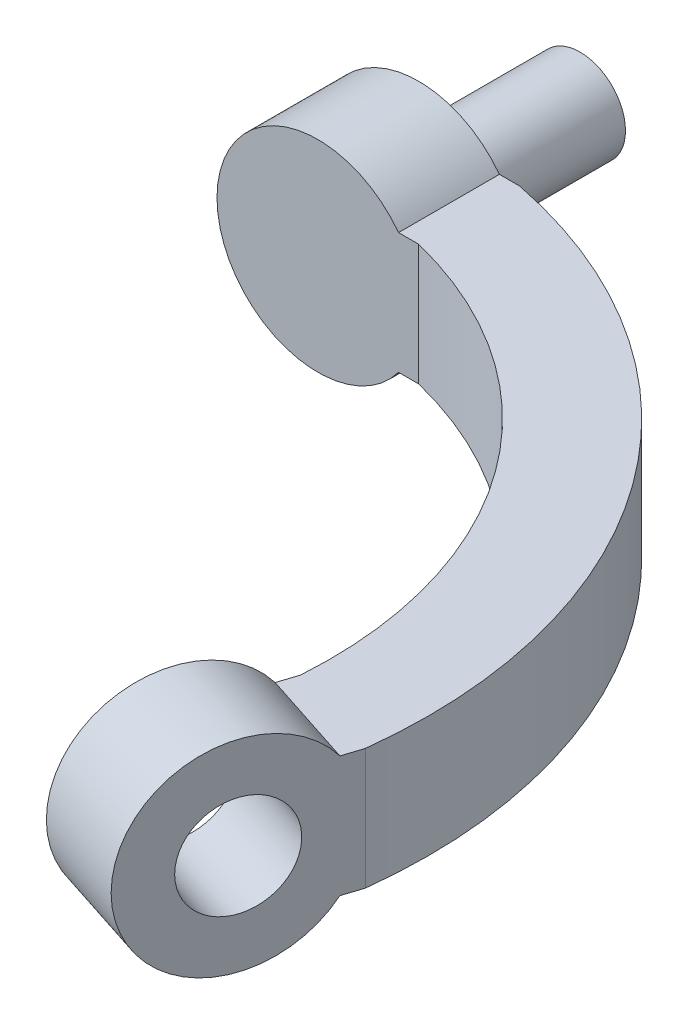
ISO-10303-21;
HEADER;
FILE_DESCRIPTION(('STEP AP214'),'2;1');
FILE_NAME('part.step','',(''),(''),'','','');
FILE_SCHEMA(('AUTOMOTIVE_DESIGN { 1 0 10303 214 1 1 1 1 }'));
ENDSEC;
DATA;
#1=APPLICATION_CONTEXT('core data for automotive mechanical design processes');
#2=APPLICATION_PROTOCOL_DEFINITION('international standard','automotive_design',2000,#1);
#3=PRODUCT_CONTEXT('',#1,'mechanical');
#4=PRODUCT('Part','Part','',(#3));
#5=PRODUCT_RELATED_PRODUCT_CATEGORY('part','',(#4));
#6=PRODUCT_DEFINITION_FORMATION('','',#4);
#7=PRODUCT_DEFINITION_CONTEXT('part definition',#1,'design');
#8=PRODUCT_DEFINITION('design','',#6,#7);
#9=PRODUCT_DEFINITION_SHAPE('','',#8);
#10=(LENGTH_UNIT() NAMED_UNIT(*) SI_UNIT(.MILLI.,.METRE.));
#11=(NAMED_UNIT(*) PLANE_ANGLE_UNIT() SI_UNIT($,.RADIAN.));
#12=(NAMED_UNIT(*) SI_UNIT($,.STERADIAN.) SOLID_ANGLE_UNIT());
#13=UNCERTAINTY_MEASURE_WITH_UNIT(LENGTH_MEASURE(1.E-05),#10,'distance_accuracy_value','');
#14=(GEOMETRIC_REPRESENTATION_CONTEXT(3) GLOBAL_UNCERTAINTY_ASSIGNED_CONTEXT((#13)) GLOBAL_UNIT_ASSIGNED_CONTEXT((#10,
#11,#12)) REPRESENTATION_CONTEXT('',''));
#15=CARTESIAN_POINT('',(0.,0.,0.));
#16=DIRECTION('',(0.,0.,1.));
#17=DIRECTION('',(1.,0.,0.));
#18=AXIS2_PLACEMENT_3D('',#15,#16,#17);
#19=CARTESIAN_POINT('',(0.,0.,5.));
#20=DIRECTION('',(0.,0.,-1.));
#21=DIRECTION('',(-1.,0.,0.));
#22=AXIS2_PLACEMENT_3D('',#19,#20,#21);
#23=CYLINDRICAL_SURFACE('',#22,5.);
#24=DIRECTION('',(0.,0.,-1.));
#25=VECTOR('',#24,1.);
#26=CARTESIAN_POINT('',(4.,-3.,5.));
#27=LINE('',#26,#25);
#28=CARTESIAN_POINT('',(4.,-3.,5.));
#29=VERTEX_POINT('',#28);
#30=CARTESIAN_POINT('',(4.,-3.,0.));
#31=VERTEX_POINT('',#30);
#32=EDGE_CURVE('E51',#29,#31,#27,.T.);
#33=ORIENTED_EDGE('',*,*,#32,.F.);
#34=CARTESIAN_POINT('',(0.,0.,5.));
#35=DIRECTION('',(0.,0.,1.));
#36=DIRECTION('',(1.,0.,0.));
#37=AXIS2_PLACEMENT_3D('',#34,#35,#36);
#38=CIRCLE('',#37,5.);
#39=CARTESIAN_POINT('',(4.,3.,5.));
#40=VERTEX_POINT('',#39);
#41=EDGE_CURVE('E11',#40,#29,#38,.T.);
#42=ORIENTED_EDGE('',*,*,#41,.F.);
#43=DIRECTION('',(0.,0.,-1.));
#44=VECTOR('',#43,1.);
#45=CARTESIAN_POINT('',(4.,3.,5.));
#46=LINE('',#45,#44);
#47=CARTESIAN_POINT('',(4.,3.,0.));
#48=VERTEX_POINT('',#47);
#49=EDGE_CURVE('E150',#48,#40,#46,.F.);
#50=ORIENTED_EDGE('',*,*,#49,.F.);
#51=CARTESIAN_POINT('',(0.,0.,0.));
#52=DIRECTION('',(0.,0.,1.));
#53=DIRECTION('',(1.,0.,0.));
#54=AXIS2_PLACEMENT_3D('',#51,#52,#53);
#55=CIRCLE('',#54,5.);
#56=EDGE_CURVE('E40',#48,#31,#55,.T.);
#57=ORIENTED_EDGE('',*,*,#56,.T.);
#58=EDGE_LOOP('',(#33,#42,#50,#57));
#59=FACE_BOUND('',#58,.T.);
#60=ADVANCED_FACE('F37',(#59),#23,.T.);
#61=CARTESIAN_POINT('',(0.,0.,5.));
#62=DIRECTION('',(0.,0.,1.));
#63=DIRECTION('',(1.,0.,0.));
#64=AXIS2_PLACEMENT_3D('',#61,#62,#63);
#65=PLANE('',#64);
#66=DIRECTION('',(1.,0.,0.));
#67=VECTOR('',#66,1.);
#68=CARTESIAN_POINT('',(2.,-3.,4.99999999999998));
#69=LINE('',#68,#67);
#70=CARTESIAN_POINT('',(4.9999999999999,-3.,4.99999999999998));
#71=VERTEX_POINT('',#70);
#72=EDGE_CURVE('E147',#29,#71,#69,.T.);
#73=ORIENTED_EDGE('',*,*,#72,.T.);
#74=DIRECTION('',(0.,1.,0.));
#75=VECTOR('',#74,1.);
#76=CARTESIAN_POINT('',(5.,-3.,4.99999999999998));
#77=LINE('',#76,#75);
#78=CARTESIAN_POINT('',(4.9999999999999,3.,4.99999999999998));
#79=VERTEX_POINT('',#78);
#80=EDGE_CURVE('E134',#71,#79,#77,.T.);
#81=ORIENTED_EDGE('',*,*,#80,.T.);
#82=DIRECTION('',(1.,0.,0.));
#83=VECTOR('',#82,1.);
#84=CARTESIAN_POINT('',(2.,3.,4.99999999999998));
#85=LINE('',#84,#83);
#86=EDGE_CURVE('E122',#40,#79,#85,.T.);
#87=ORIENTED_EDGE('',*,*,#86,.F.);
#88=ORIENTED_EDGE('',*,*,#41,.T.);
#89=EDGE_LOOP('',(#73,#81,#87,#88));
#90=FACE_BOUND('',#89,.T.);
#91=ADVANCED_FACE('F206',(#90),#65,.T.);
#92=CARTESIAN_POINT('',(0.,0.,0.));
#93=DIRECTION('',(0.,0.,1.));
#94=DIRECTION('',(1.,0.,0.));
#95=AXIS2_PLACEMENT_3D('',#92,#93,#94);
#96=PLANE('',#95);
#97=CARTESIAN_POINT('',(0.,0.,0.));
#98=DIRECTION('',(0.,0.,1.));
#99=DIRECTION('',(1.,0.,0.));
#100=AXIS2_PLACEMENT_3D('',#97,#98,#99);
#101=CIRCLE('',#100,2.25);
#102=CARTESIAN_POINT('',(2.25,0.,0.));
#103=VERTEX_POINT('',#102);
#104=EDGE_CURVE('E188',#103,#103,#101,.T.);
#105=ORIENTED_EDGE('',*,*,#104,.T.);
#106=EDGE_LOOP('',(#105));
#107=FACE_BOUND('',#106,.T.);
#108=ORIENTED_EDGE('',*,*,#56,.F.);
#109=DIRECTION('',(1.,0.,0.));
#110=VECTOR('',#109,1.);
#111=CARTESIAN_POINT('',(2.,3.,0.));
#112=LINE('',#111,#110);
#113=CARTESIAN_POINT('',(5.,3.,0.));
#114=VERTEX_POINT('',#113);
#115=EDGE_CURVE('E143',#48,#114,#112,.T.);
#116=ORIENTED_EDGE('',*,*,#115,.T.);
#117=DIRECTION('',(0.,-1.,0.));
#118=VECTOR('',#117,1.);
#119=CARTESIAN_POINT('',(5.,3.,0.));
#120=LINE('',#119,#118);
#121=CARTESIAN_POINT('',(5.,-3.,0.));
#122=VERTEX_POINT('',#121);
#123=EDGE_CURVE('E137',#114,#122,#120,.T.);
#124=ORIENTED_EDGE('',*,*,#123,.T.);
#125=DIRECTION('',(1.,0.,0.));
#126=VECTOR('',#125,1.);
#127=CARTESIAN_POINT('',(2.,-3.,0.));
#128=LINE('',#127,#126);
#129=EDGE_CURVE('E140',#31,#122,#128,.T.);
#130=ORIENTED_EDGE('',*,*,#129,.F.);
#131=EDGE_LOOP('',(#108,#116,#124,#130));
#132=FACE_BOUND('',#131,.T.);
#133=ADVANCED_FACE('F157',(#107,#132),#96,.F.);
#134=CARTESIAN_POINT('',(2.,-3.,0.));
#135=DIRECTION('',(0.,1.,0.));
#136=DIRECTION('',(0.,0.,1.));
#137=AXIS2_PLACEMENT_3D('',#134,#135,#136);
#138=PLANE('',#137);
#139=ORIENTED_EDGE('',*,*,#72,.F.);
#140=ORIENTED_EDGE('',*,*,#32,.T.);
#141=ORIENTED_EDGE('',*,*,#129,.T.);
#142=CARTESIAN_POINT('',(0.,-3.,25.));
#143=DIRECTION('',(0.,1.,0.));
#144=DIRECTION('',(0.,0.,1.));
#145=AXIS2_PLACEMENT_3D('',#142,#143,#144);
#146=CIRCLE('',#145,25.4950975679639);
#147=CARTESIAN_POINT('',(25.3214978792536,-3.,27.9701422778978));
#148=VERTEX_POINT('',#147);
#149=EDGE_CURVE('E124',#122,#148,#146,.F.);
#150=ORIENTED_EDGE('',*,*,#149,.T.);
#151=DIRECTION('',(0.309016994374945,0.,-0.951056516295154));
#152=VECTOR('',#151,1.);
#153=CARTESIAN_POINT('',(24.3944468961288,-3.,30.8233118267833));
#154=LINE('',#153,#152);
#155=CARTESIAN_POINT('',(25.0124808848787,-3.,28.921198794193));
#156=VERTEX_POINT('',#155);
#157=EDGE_CURVE('E165',#156,#148,#154,.T.);
#158=ORIENTED_EDGE('',*,*,#157,.F.);
#159=DIRECTION('',(-0.951056516295155,0.,-0.309016994374944));
#160=VECTOR('',#159,1.);
#161=CARTESIAN_POINT('',(1.23606797749978,-3.,21.1957739348194));
#162=LINE('',#161,#160);
#163=CARTESIAN_POINT('',(20.2571983034029,-3.,27.3761138223183));
#164=VERTEX_POINT('',#163);
#165=EDGE_CURVE('E172',#156,#164,#162,.T.);
#166=ORIENTED_EDGE('',*,*,#165,.T.);
#167=DIRECTION('',(0.309016994374945,0.,-0.951056516295154));
#168=VECTOR('',#167,1.);
#169=CARTESIAN_POINT('',(19.639164314653,-3.,29.2782268549086));
#170=LINE('',#169,#168);
#171=CARTESIAN_POINT('',(20.5662152977778,-3.,26.4250573060231));
#172=VERTEX_POINT('',#171);
#173=EDGE_CURVE('E117',#164,#172,#170,.T.);
#174=ORIENTED_EDGE('',*,*,#173,.T.);
#175=CARTESIAN_POINT('',(0.,-3.,25.));
#176=DIRECTION('',(0.,1.,0.));
#177=DIRECTION('',(0.,0.,1.));
#178=AXIS2_PLACEMENT_3D('',#175,#176,#177);
#179=CIRCLE('',#178,20.6155281280883);
#180=EDGE_CURVE('E104',#71,#172,#179,.F.);
#181=ORIENTED_EDGE('',*,*,#180,.F.);
#182=EDGE_LOOP('',(#139,#140,#141,#150,#158,#166,#174,#181));
#183=FACE_BOUND('',#182,.T.);
#184=ADVANCED_FACE('F164',(#183),#138,.F.);
#185=CARTESIAN_POINT('',(2.,3.,4.99999999999998));
#186=DIRECTION('',(0.,-1.,0.));
#187=DIRECTION('',(0.,0.,-1.));
#188=AXIS2_PLACEMENT_3D('',#185,#186,#187);
#189=PLANE('',#188);
#190=ORIENTED_EDGE('',*,*,#115,.F.);
#191=ORIENTED_EDGE('',*,*,#49,.T.);
#192=ORIENTED_EDGE('',*,*,#86,.T.);
#193=CARTESIAN_POINT('',(0.,3.,25.));
#194=DIRECTION('',(0.,1.,0.));
#195=DIRECTION('',(0.,0.,1.));
#196=AXIS2_PLACEMENT_3D('',#193,#194,#195);
#197=CIRCLE('',#196,20.6155281280883);
#198=CARTESIAN_POINT('',(20.5662152977778,3.,26.4250573060231));
#199=VERTEX_POINT('',#198);
#200=EDGE_CURVE('E101',#79,#199,#197,.F.);
#201=ORIENTED_EDGE('',*,*,#200,.T.);
#202=DIRECTION('',(0.309016994374945,0.,-0.951056516295154));
#203=VECTOR('',#202,1.);
#204=CARTESIAN_POINT('',(19.639164314653,3.,29.2782268549086));
#205=LINE('',#204,#203);
#206=CARTESIAN_POINT('',(20.2571983034029,3.,27.3761138223183));
#207=VERTEX_POINT('',#206);
#208=EDGE_CURVE('E110',#207,#199,#205,.T.);
#209=ORIENTED_EDGE('',*,*,#208,.F.);
#210=DIRECTION('',(-0.951056516295155,0.,-0.309016994374944));
#211=VECTOR('',#210,1.);
#212=CARTESIAN_POINT('',(1.23606797749978,3.,21.1957739348194));
#213=LINE('',#212,#211);
#214=CARTESIAN_POINT('',(25.0124808848787,3.,28.921198794193));
#215=VERTEX_POINT('',#214);
#216=EDGE_CURVE('E175',#215,#207,#213,.T.);
#217=ORIENTED_EDGE('',*,*,#216,.F.);
#218=DIRECTION('',(0.309016994374945,0.,-0.951056516295154));
#219=VECTOR('',#218,1.);
#220=CARTESIAN_POINT('',(24.3944468961288,3.,30.8233118267833));
#221=LINE('',#220,#219);
#222=CARTESIAN_POINT('',(25.3214978792536,3.,27.9701422778978));
#223=VERTEX_POINT('',#222);
#224=EDGE_CURVE('E116',#215,#223,#221,.T.);
#225=ORIENTED_EDGE('',*,*,#224,.T.);
#226=CARTESIAN_POINT('',(0.,3.,25.));
#227=DIRECTION('',(0.,1.,0.));
#228=DIRECTION('',(0.,0.,1.));
#229=AXIS2_PLACEMENT_3D('',#226,#227,#228);
#230=CIRCLE('',#229,25.4950975679639);
#231=EDGE_CURVE('E125',#114,#223,#230,.F.);
#232=ORIENTED_EDGE('',*,*,#231,.F.);
#233=EDGE_LOOP('',(#190,#191,#192,#201,#209,#217,#225,#232));
#234=FACE_BOUND('',#233,.T.);
#235=ADVANCED_FACE('F120',(#234),#189,.F.);
#236=CARTESIAN_POINT('',(0.,-3.,25.));
#237=DIRECTION('',(0.,1.,0.));
#238=DIRECTION('',(0.,0.,1.));
#239=AXIS2_PLACEMENT_3D('',#236,#237,#238);
#240=CYLINDRICAL_SURFACE('',#239,25.4950975679639);
#241=ORIENTED_EDGE('',*,*,#123,.F.);
#242=ORIENTED_EDGE('',*,*,#231,.T.);
#243=DIRECTION('',(0.,1.,0.));
#244=VECTOR('',#243,1.);
#245=CARTESIAN_POINT('',(25.3214978792536,-3.,27.9701422778978));
#246=LINE('',#245,#244);
#247=EDGE_CURVE('E107',#148,#223,#246,.T.);
#248=ORIENTED_EDGE('',*,*,#247,.F.);
#249=ORIENTED_EDGE('',*,*,#149,.F.);
#250=EDGE_LOOP('',(#241,#242,#248,#249));
#251=FACE_BOUND('',#250,.T.);
#252=ADVANCED_FACE('F163',(#251),#240,.T.);
#253=CARTESIAN_POINT('',(0.,-3.,25.));
#254=DIRECTION('',(0.,1.,0.));
#255=DIRECTION('',(0.,0.,1.));
#256=AXIS2_PLACEMENT_3D('',#253,#254,#255);
#257=CYLINDRICAL_SURFACE('',#256,20.6155281280883);
#258=DIRECTION('',(0.,1.,0.));
#259=VECTOR('',#258,1.);
#260=CARTESIAN_POINT('',(20.5662152977778,-3.,26.4250573060231));
#261=LINE('',#260,#259);
#262=EDGE_CURVE('E97',#172,#199,#261,.T.);
#263=ORIENTED_EDGE('',*,*,#262,.T.);
#264=ORIENTED_EDGE('',*,*,#200,.F.);
#265=ORIENTED_EDGE('',*,*,#80,.F.);
#266=ORIENTED_EDGE('',*,*,#180,.T.);
#267=EDGE_LOOP('',(#263,#264,#265,#266));
#268=FACE_BOUND('',#267,.T.);
#269=ADVANCED_FACE('F99',(#268),#257,.F.);
#270=CARTESIAN_POINT('',(24.3944468961288,-3.,30.8233118267833));
#271=DIRECTION('',(-0.951056516295154,0.,-0.309016994374945));
#272=DIRECTION('',(-0.309016994374945,0.,0.951056516295155));
#273=AXIS2_PLACEMENT_3D('',#270,#271,#272);
#274=PLANE('',#273);
#275=CARTESIAN_POINT('',(23.7764129073789,0.,32.7254248593736));
#276=DIRECTION('',(-0.951056516295155,0.,-0.309016994374945));
#277=DIRECTION('',(-0.309016994374945,0.,0.951056516295155));
#278=AXIS2_PLACEMENT_3D('',#275,#276,#277);
#279=CIRCLE('',#278,2.5);
#280=CARTESIAN_POINT('',(23.0038704214415,0.,35.1030661501115));
#281=VERTEX_POINT('',#280);
#282=EDGE_CURVE('E181',#281,#281,#279,.T.);
#283=ORIENTED_EDGE('',*,*,#282,.T.);
#284=EDGE_LOOP('',(#283));
#285=FACE_BOUND('',#284,.T.);
#286=CARTESIAN_POINT('',(23.7764129073789,0.,32.7254248593736));
#287=DIRECTION('',(-0.951056516295155,0.,-0.309016994374944));
#288=DIRECTION('',(-0.309016994374944,0.,0.951056516295155));
#289=AXIS2_PLACEMENT_3D('',#286,#287,#288);
#290=CIRCLE('',#289,5.);
#291=EDGE_CURVE('E171',#156,#215,#290,.T.);
#292=ORIENTED_EDGE('',*,*,#291,.F.);
#293=ORIENTED_EDGE('',*,*,#157,.T.);
#294=ORIENTED_EDGE('',*,*,#247,.T.);
#295=ORIENTED_EDGE('',*,*,#224,.F.);
#296=EDGE_LOOP('',(#292,#293,#294,#295));
#297=FACE_BOUND('',#296,.T.);
#298=ADVANCED_FACE('F169',(#285,#297),#274,.F.);
#299=CARTESIAN_POINT('',(19.639164314653,3.,29.2782268549086));
#300=DIRECTION('',(0.951056516295154,0.,0.309016994374945));
#301=DIRECTION('',(0.309016994374945,0.,-0.951056516295155));
#302=AXIS2_PLACEMENT_3D('',#299,#300,#301);
#303=PLANE('',#302);
#304=CARTESIAN_POINT('',(19.0211303259031,0.,31.1803398874989));
#305=DIRECTION('',(-0.951056516295155,0.,-0.309016994374945));
#306=DIRECTION('',(-0.309016994374945,0.,0.951056516295155));
#307=AXIS2_PLACEMENT_3D('',#304,#305,#306);
#308=CIRCLE('',#307,2.5);
#309=CARTESIAN_POINT('',(18.2485878399658,0.,33.5579811782368));
#310=VERTEX_POINT('',#309);
#311=EDGE_CURVE('E182',#310,#310,#308,.T.);
#312=ORIENTED_EDGE('',*,*,#311,.F.);
#313=EDGE_LOOP('',(#312));
#314=FACE_BOUND('',#313,.T.);
#315=ORIENTED_EDGE('',*,*,#173,.F.);
#316=CARTESIAN_POINT('',(19.0211303259031,0.,31.1803398874989));
#317=DIRECTION('',(-0.951056516295155,0.,-0.309016994374944));
#318=DIRECTION('',(-0.309016994374944,0.,0.951056516295155));
#319=AXIS2_PLACEMENT_3D('',#316,#317,#318);
#320=CIRCLE('',#319,5.);
#321=EDGE_CURVE('E113',#164,#207,#320,.T.);
#322=ORIENTED_EDGE('',*,*,#321,.T.);
#323=ORIENTED_EDGE('',*,*,#208,.T.);
#324=ORIENTED_EDGE('',*,*,#262,.F.);
#325=EDGE_LOOP('',(#315,#322,#323,#324));
#326=FACE_BOUND('',#325,.T.);
#327=ADVANCED_FACE('F111',(#314,#326),#303,.F.);
#328=CARTESIAN_POINT('',(0.,0.,25.));
#329=DIRECTION('',(-0.951056516295155,0.,-0.309016994374944));
#330=DIRECTION('',(-0.309016994374944,0.,0.951056516295155));
#331=AXIS2_PLACEMENT_3D('',#328,#329,#330);
#332=CYLINDRICAL_SURFACE('',#331,5.);
#333=ORIENTED_EDGE('',*,*,#165,.F.);
#334=ORIENTED_EDGE('',*,*,#291,.T.);
#335=ORIENTED_EDGE('',*,*,#216,.T.);
#336=ORIENTED_EDGE('',*,*,#321,.F.);
#337=EDGE_LOOP('',(#333,#334,#335,#336));
#338=FACE_BOUND('',#337,.T.);
#339=ADVANCED_FACE('F230',(#338),#332,.T.);
#340=CARTESIAN_POINT('',(23.7764129073789,0.,32.7254248593736));
#341=DIRECTION('',(-0.951056516295155,0.,-0.309016994374945));
#342=DIRECTION('',(-0.309016994374945,0.,0.951056516295155));
#343=AXIS2_PLACEMENT_3D('',#340,#341,#342);
#344=CYLINDRICAL_SURFACE('',#343,2.5);
#345=ORIENTED_EDGE('',*,*,#282,.F.);
#346=EDGE_LOOP('',(#345));
#347=FACE_BOUND('',#346,.T.);
#348=ORIENTED_EDGE('',*,*,#311,.T.);
#349=EDGE_LOOP('',(#348));
#350=FACE_BOUND('',#349,.T.);
#351=ADVANCED_FACE('F203',(#347,#350),#344,.F.);
#352=CARTESIAN_POINT('',(0.,0.,-8.));
#353=DIRECTION('',(0.,0.,1.));
#354=DIRECTION('',(1.,0.,0.));
#355=AXIS2_PLACEMENT_3D('',#352,#353,#354);
#356=CYLINDRICAL_SURFACE('',#355,2.25);
#357=CARTESIAN_POINT('',(0.,0.,-8.));
#358=DIRECTION('',(0.,0.,1.));
#359=DIRECTION('',(1.,0.,0.));
#360=AXIS2_PLACEMENT_3D('',#357,#358,#359);
#361=CIRCLE('',#360,2.25);
#362=CARTESIAN_POINT('',(2.25,0.,-8.));
#363=VERTEX_POINT('',#362);
#364=EDGE_CURVE('E185',#363,#363,#361,.T.);
#365=ORIENTED_EDGE('',*,*,#364,.T.);
#366=EDGE_LOOP('',(#365));
#367=FACE_BOUND('',#366,.T.);
#368=ORIENTED_EDGE('',*,*,#104,.F.);
#369=EDGE_LOOP('',(#368));
#370=FACE_BOUND('',#369,.T.);
#371=ADVANCED_FACE('F194',(#367,#370),#356,.T.);
#372=CARTESIAN_POINT('',(0.,0.,-8.));
#373=DIRECTION('',(0.,0.,1.));
#374=DIRECTION('',(1.,0.,0.));
#375=AXIS2_PLACEMENT_3D('',#372,#373,#374);
#376=PLANE('',#375);
#377=ORIENTED_EDGE('',*,*,#364,.F.);
#378=EDGE_LOOP('',(#377));
#379=FACE_BOUND('',#378,.T.);
#380=ADVANCED_FACE('F197',(#379),#376,.F.);
#381=CLOSED_SHELL('',(#60,#91,#133,#184,#235,#252,#269,#298,#327,#339,#351,#371,#380));
#382=MANIFOLD_SOLID_BREP('B2',#381);
#383=ADVANCED_BREP_SHAPE_REPRESENTATION('',(#18,#382),#14);
#384=SHAPE_DEFINITION_REPRESENTATION(#9,#383);
ENDSEC;
END-ISO-10303-21;
